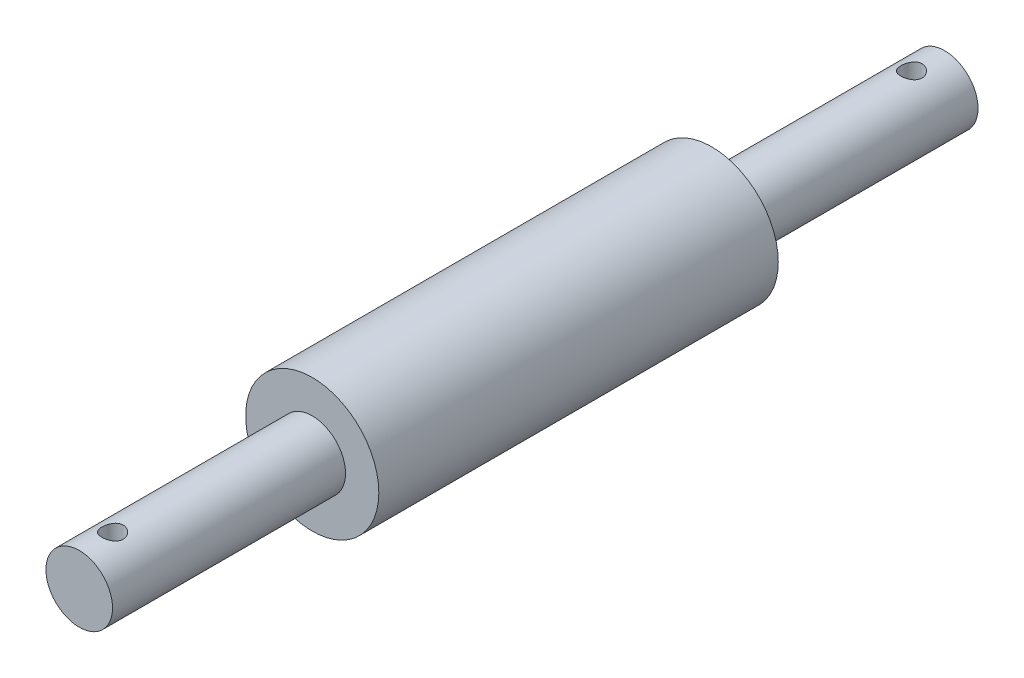
ISO-10303-21;
HEADER;
FILE_DESCRIPTION(('STEP AP214'),'2;1');
FILE_NAME('part.step','',(''),(''),'','','');
FILE_SCHEMA(('AUTOMOTIVE_DESIGN { 1 0 10303 214 1 1 1 1 }'));
ENDSEC;
DATA;
#1=APPLICATION_CONTEXT('core data for automotive mechanical design processes');
#2=APPLICATION_PROTOCOL_DEFINITION('international standard','automotive_design',2000,#1);
#3=PRODUCT_CONTEXT('',#1,'mechanical');
#4=PRODUCT('Part','Part','',(#3));
#5=PRODUCT_RELATED_PRODUCT_CATEGORY('part','',(#4));
#6=PRODUCT_DEFINITION_FORMATION('','',#4);
#7=PRODUCT_DEFINITION_CONTEXT('part definition',#1,'design');
#8=PRODUCT_DEFINITION('design','',#6,#7);
#9=PRODUCT_DEFINITION_SHAPE('','',#8);
#10=(LENGTH_UNIT() NAMED_UNIT(*) SI_UNIT(.MILLI.,.METRE.));
#11=(NAMED_UNIT(*) PLANE_ANGLE_UNIT() SI_UNIT($,.RADIAN.));
#12=(NAMED_UNIT(*) SI_UNIT($,.STERADIAN.) SOLID_ANGLE_UNIT());
#13=UNCERTAINTY_MEASURE_WITH_UNIT(LENGTH_MEASURE(1.E-05),#10,'distance_accuracy_value','');
#14=(GEOMETRIC_REPRESENTATION_CONTEXT(3) GLOBAL_UNCERTAINTY_ASSIGNED_CONTEXT((#13)) GLOBAL_UNIT_ASSIGNED_CONTEXT((#10,
#11,#12)) REPRESENTATION_CONTEXT('',''));
#15=CARTESIAN_POINT('',(0.,0.,0.));
#16=DIRECTION('',(0.,0.,1.));
#17=DIRECTION('',(1.,0.,0.));
#18=AXIS2_PLACEMENT_3D('',#15,#16,#17);
#19=CARTESIAN_POINT('',(0.,0.,130.));
#20=DIRECTION('',(0.,0.,-1.));
#21=DIRECTION('',(-1.,0.,0.));
#22=AXIS2_PLACEMENT_3D('',#19,#20,#21);
#23=CYLINDRICAL_SURFACE('',#22,5.);
#24=CARTESIAN_POINT('',(0.,-5.,126.6));
#25=CARTESIAN_POINT('',(0.0874958063159812,-4.99999978543627,126.599999756349));
#26=CARTESIAN_POINT('',(0.174994637059064,-4.99768184156355,126.592799404721));
#27=CARTESIAN_POINT('',(0.347426901237486,-4.98866262172227,126.564268180471));
#28=CARTESIAN_POINT('',(0.43235986337371,-4.98196054553558,126.542934728182));
#29=CARTESIAN_POINT('',(0.59714922579156,-4.9649038363541,126.486935078788));
#30=CARTESIAN_POINT('',(0.677013473384584,-4.95455502045191,126.452290107629));
#31=CARTESIAN_POINT('',(0.829798762851146,-4.93126901642872,126.370743169913));
#32=CARTESIAN_POINT('',(0.902718607024938,-4.91833138300386,126.323839094234));
#33=CARTESIAN_POINT('',(1.04189475779498,-4.89077067933825,126.217515886496));
#34=CARTESIAN_POINT('',(1.1078960922464,-4.87610957732918,126.157772901047));
#35=CARTESIAN_POINT('',(1.22913423693228,-4.8469706570307,126.028156933453));
#36=CARTESIAN_POINT('',(1.28436891793797,-4.83249287552328,125.958281952345));
#37=CARTESIAN_POINT('',(1.38391395073832,-4.80494810799029,125.80814714549));
#38=CARTESIAN_POINT('',(1.42790123109944,-4.79192785635417,125.727663718729));
#39=CARTESIAN_POINT('',(1.5016091713459,-4.76934657798646,125.55995765623));
#40=CARTESIAN_POINT('',(1.53133379773326,-4.75978458968016,125.472736902012));
#41=CARTESIAN_POINT('',(1.57473134311321,-4.74560122760597,125.296917392727));
#42=CARTESIAN_POINT('',(1.58887896846386,-4.74083414932744,125.208447898248));
#43=CARTESIAN_POINT('',(1.60220433058851,-4.73634831045,125.030272400816));
#44=CARTESIAN_POINT('',(1.6013862709372,-4.73662813227306,124.940566752148));
#45=CARTESIAN_POINT('',(1.58517380736381,-4.74207619100075,124.766434415112));
#46=CARTESIAN_POINT('',(1.57038842132725,-4.7470401743042,124.681943546555));
#47=CARTESIAN_POINT('',(1.52765058974139,-4.76096457446162,124.516711155578));
#48=CARTESIAN_POINT('',(1.49969668269327,-4.76992543490025,124.435970050415));
#49=CARTESIAN_POINT('',(1.43099645158812,-4.7909865416364,124.279102141174));
#50=CARTESIAN_POINT('',(1.39006273103722,-4.80313229469363,124.203063780049));
#51=CARTESIAN_POINT('',(1.29669494334068,-4.82917444861168,124.058737956973));
#52=CARTESIAN_POINT('',(1.24425776827155,-4.8430713221454,123.990452597256));
#53=CARTESIAN_POINT('',(1.12640551540388,-4.87186372141871,123.860135327134));
#54=CARTESIAN_POINT('',(1.06048936249403,-4.8867752080818,123.798559223061));
#55=CARTESIAN_POINT('',(0.91908143221716,-4.91533168114877,123.687221321766));
#56=CARTESIAN_POINT('',(0.843588875652704,-4.92897656433707,123.637460486857));
#57=CARTESIAN_POINT('',(0.68426158071238,-4.95361789744584,123.55083655672));
#58=CARTESIAN_POINT('',(0.600361279440642,-4.96459080547942,123.514086899164));
#59=CARTESIAN_POINT('',(0.427135850361136,-4.98248161100196,123.455360403337));
#60=CARTESIAN_POINT('',(0.337812463131553,-4.98940080204637,123.433378852183));
#61=CARTESIAN_POINT('',(0.160141789589322,-4.99819424239135,123.405599933335));
#62=CARTESIAN_POINT('',(0.0719002860170767,-5.00026060178154,123.399185926389));
#63=CARTESIAN_POINT('',(-0.104410269588104,-4.99968655318444,123.400979218221));
#64=CARTESIAN_POINT('',(-0.192479346087439,-4.99704687004206,123.40918426531));
#65=CARTESIAN_POINT('',(-0.363535018203811,-4.98748380317497,123.439490113081));
#66=CARTESIAN_POINT('',(-0.446594362478021,-4.98067486649266,123.461219910086));
#67=CARTESIAN_POINT('',(-0.607861654600579,-4.96357585995349,123.517501799396));
#68=CARTESIAN_POINT('',(-0.686068993794122,-4.95328535439547,123.552055496602));
#69=CARTESIAN_POINT('',(-0.837596923870446,-4.92995531019905,123.633971017178));
#70=CARTESIAN_POINT('',(-0.91074562050097,-4.9168532627009,123.681632511942));
#71=CARTESIAN_POINT('',(-1.04821150300662,-4.8893940824048,123.788053872986));
#72=CARTESIAN_POINT('',(-1.11252617555398,-4.87503659432078,123.846816886458));
#73=CARTESIAN_POINT('',(-1.23328321488635,-4.84592967283237,123.976674159611));
#74=CARTESIAN_POINT('',(-1.2892857947562,-4.83118884166735,124.048180267688));
#75=CARTESIAN_POINT('',(-1.38854141992569,-4.80360443110145,124.199894674458));
#76=CARTESIAN_POINT('',(-1.43179457025641,-4.79076083607138,124.280102901454));
#77=CARTESIAN_POINT('',(-1.50407580301231,-4.76856262886575,124.446843578656));
#78=CARTESIAN_POINT('',(-1.53315066307446,-4.75919656820051,124.53335413499));
#79=CARTESIAN_POINT('',(-1.57620668246201,-4.74511281699328,124.71040720981));
#80=CARTESIAN_POINT('',(-1.59019395006567,-4.74039324536734,124.800948081136));
#81=CARTESIAN_POINT('',(-1.60222535311566,-4.73633927898768,124.978875969164));
#82=CARTESIAN_POINT('',(-1.60099388446006,-4.73676019091382,125.066209011329));
#83=CARTESIAN_POINT('',(-1.5843835514937,-4.74234159093745,125.239357005435));
#84=CARTESIAN_POINT('',(-1.56900540861121,-4.74750183734632,125.325172034561));
#85=CARTESIAN_POINT('',(-1.52503332416461,-4.76180543144416,125.491483425377));
#86=CARTESIAN_POINT('',(-1.49665627942707,-4.77088327236763,125.572043198893));
#87=CARTESIAN_POINT('',(-1.42766427484383,-4.79197975594362,125.727321760401));
#88=CARTESIAN_POINT('',(-1.38704674114627,-4.80399901699919,125.802039315763));
#89=CARTESIAN_POINT('',(-1.29279266707434,-4.83023494368376,125.946809629814));
#90=CARTESIAN_POINT('',(-1.2386930843158,-4.8445211905268,126.016548262734));
#91=CARTESIAN_POINT('',(-1.11981399792887,-4.87337180847353,126.146191745821));
#92=CARTESIAN_POINT('',(-1.05503158166825,-4.88793625446695,126.206093905199));
#93=CARTESIAN_POINT('',(-0.913912210298366,-4.91631108200117,126.316458285924));
#94=CARTESIAN_POINT('',(-0.837251351760784,-4.93007751880386,126.366518951884));
#95=CARTESIAN_POINT('',(-0.676163529926932,-4.95473787697861,126.452980188097));
#96=CARTESIAN_POINT('',(-0.591739263208152,-4.96563279071294,126.489385479321));
#97=CARTESIAN_POINT('',(-0.423663431644838,-4.98268341064065,126.54524777983));
#98=CARTESIAN_POINT('',(-0.340376766487323,-4.98911901301451,126.565718450583));
#99=CARTESIAN_POINT('',(-0.171394001076115,-4.99777693541394,126.593093142904));
#100=CARTESIAN_POINT('',(-0.0856984512613927,-5.00000021015613,126.600000238645));
#101=CARTESIAN_POINT('',(0.,-5.,126.6));
#102=B_SPLINE_CURVE_WITH_KNOTS('',3,(#24,#25,#26,#27,#28,#29,#30,#31,#32,#33,#34,#35,#36,#37,
#38,#39,#40,#41,#42,#43,#44,#45,#46,#47,#48,#49,#50,#51,#52,#53,#54,#55,#56,#57,#58,#59,#60,#61,
#62,#63,#64,#65,#66,#67,#68,#69,#70,#71,#72,#73,#74,#75,#76,#77,#78,#79,#80,#81,#82,#83,#84,#85,
#86,#87,#88,#89,#90,#91,#92,#93,#94,#95,#96,#97,#98,#99,#100,#101),.UNSPECIFIED.,.T.,.F.,(4,2,2,
2,2,2,2,2,2,2,2,2,2,2,2,2,2,2,2,2,2,2,2,2,2,2,2,2,2,2,2,2,2,2,2,2,2,2,4),(0.,0.262172289866492,
0.524392446348363,0.7861962021117,1.04804502964702,1.31749718151566,1.58700256668425,
1.86354828826629,2.14001705671956,2.40780489999506,2.67551752794223,2.93207089351445,
3.18865273918778,3.44912195934763,3.70966163813008,3.98267284808621,4.25570628624554,
4.53106471334193,4.80633522466348,5.07051010591344,5.33464430132698,5.59183416387788,
5.84905622438333,6.11273355055081,6.37648573964818,6.65122993053058,6.92597185797941,
7.19980110675104,7.47351945288795,7.7342613497285,7.9949899504299,8.25151822881314,
8.50810048600701,8.77513756675918,9.04224757485581,9.31866285531258,9.5949824844973,
9.85182740305347,10.1086141011961),.UNSPECIFIED.);
#103=CARTESIAN_POINT('',(0.,-5.,126.6));
#104=VERTEX_POINT('',#103);
#105=EDGE_CURVE('E47',#104,#104,#102,.T.);
#106=ORIENTED_EDGE('',*,*,#105,.T.);
#107=EDGE_LOOP('',(#106));
#108=FACE_BOUND('',#107,.T.);
#109=CARTESIAN_POINT('',(0.,5.,126.6));
#110=CARTESIAN_POINT('',(-0.0874958063159812,4.99999978543627,126.599999756349));
#111=CARTESIAN_POINT('',(-0.174994637059064,4.99768184156355,126.592799404721));
#112=CARTESIAN_POINT('',(-0.347426901237486,4.98866262172227,126.564268180471));
#113=CARTESIAN_POINT('',(-0.43235986337371,4.98196054553558,126.542934728182));
#114=CARTESIAN_POINT('',(-0.59714922579156,4.9649038363541,126.486935078788));
#115=CARTESIAN_POINT('',(-0.677013473384584,4.95455502045191,126.452290107629));
#116=CARTESIAN_POINT('',(-0.829798762851146,4.93126901642872,126.370743169913));
#117=CARTESIAN_POINT('',(-0.902718607024938,4.91833138300386,126.323839094234));
#118=CARTESIAN_POINT('',(-1.04189475779498,4.89077067933825,126.217515886496));
#119=CARTESIAN_POINT('',(-1.1078960922464,4.87610957732918,126.157772901047));
#120=CARTESIAN_POINT('',(-1.22913423693228,4.8469706570307,126.028156933453));
#121=CARTESIAN_POINT('',(-1.28436891793797,4.83249287552328,125.958281952345));
#122=CARTESIAN_POINT('',(-1.38391395073832,4.80494810799029,125.80814714549));
#123=CARTESIAN_POINT('',(-1.42790123109944,4.79192785635417,125.727663718729));
#124=CARTESIAN_POINT('',(-1.5016091713459,4.76934657798646,125.55995765623));
#125=CARTESIAN_POINT('',(-1.53133379773326,4.75978458968016,125.472736902012));
#126=CARTESIAN_POINT('',(-1.57473134311321,4.74560122760597,125.296917392727));
#127=CARTESIAN_POINT('',(-1.58887896846386,4.74083414932744,125.208447898248));
#128=CARTESIAN_POINT('',(-1.60220433058851,4.73634831045,125.030272400816));
#129=CARTESIAN_POINT('',(-1.6013862709372,4.73662813227306,124.940566752148));
#130=CARTESIAN_POINT('',(-1.58517380736381,4.74207619100075,124.766434415112));
#131=CARTESIAN_POINT('',(-1.57038842132725,4.7470401743042,124.681943546555));
#132=CARTESIAN_POINT('',(-1.52765058974139,4.76096457446162,124.516711155578));
#133=CARTESIAN_POINT('',(-1.49969668269327,4.76992543490025,124.435970050415));
#134=CARTESIAN_POINT('',(-1.43099645158812,4.7909865416364,124.279102141174));
#135=CARTESIAN_POINT('',(-1.39006273103722,4.80313229469363,124.203063780049));
#136=CARTESIAN_POINT('',(-1.29669494334068,4.82917444861168,124.058737956973));
#137=CARTESIAN_POINT('',(-1.24425776827155,4.8430713221454,123.990452597256));
#138=CARTESIAN_POINT('',(-1.12640551540388,4.87186372141871,123.860135327134));
#139=CARTESIAN_POINT('',(-1.06048936249403,4.8867752080818,123.798559223061));
#140=CARTESIAN_POINT('',(-0.91908143221716,4.91533168114877,123.687221321766));
#141=CARTESIAN_POINT('',(-0.843588875652704,4.92897656433707,123.637460486857));
#142=CARTESIAN_POINT('',(-0.68426158071238,4.95361789744584,123.55083655672));
#143=CARTESIAN_POINT('',(-0.600361279440642,4.96459080547942,123.514086899164));
#144=CARTESIAN_POINT('',(-0.427135850361136,4.98248161100196,123.455360403337));
#145=CARTESIAN_POINT('',(-0.337812463131553,4.98940080204637,123.433378852183));
#146=CARTESIAN_POINT('',(-0.160141789589322,4.99819424239135,123.405599933335));
#147=CARTESIAN_POINT('',(-0.0719002860170767,5.00026060178154,123.399185926389));
#148=CARTESIAN_POINT('',(0.104410269588104,4.99968655318444,123.400979218221));
#149=CARTESIAN_POINT('',(0.192479346087439,4.99704687004206,123.40918426531));
#150=CARTESIAN_POINT('',(0.363535018203811,4.98748380317497,123.439490113081));
#151=CARTESIAN_POINT('',(0.446594362478021,4.98067486649266,123.461219910086));
#152=CARTESIAN_POINT('',(0.607861654600579,4.96357585995349,123.517501799396));
#153=CARTESIAN_POINT('',(0.686068993794122,4.95328535439547,123.552055496602));
#154=CARTESIAN_POINT('',(0.837596923870446,4.92995531019905,123.633971017178));
#155=CARTESIAN_POINT('',(0.91074562050097,4.9168532627009,123.681632511942));
#156=CARTESIAN_POINT('',(1.04821150300662,4.8893940824048,123.788053872986));
#157=CARTESIAN_POINT('',(1.11252617555398,4.87503659432078,123.846816886458));
#158=CARTESIAN_POINT('',(1.23328321488635,4.84592967283237,123.976674159611));
#159=CARTESIAN_POINT('',(1.2892857947562,4.83118884166735,124.048180267688));
#160=CARTESIAN_POINT('',(1.38854141992569,4.80360443110145,124.199894674458));
#161=CARTESIAN_POINT('',(1.43179457025641,4.79076083607138,124.280102901454));
#162=CARTESIAN_POINT('',(1.50407580301231,4.76856262886575,124.446843578656));
#163=CARTESIAN_POINT('',(1.53315066307446,4.75919656820051,124.53335413499));
#164=CARTESIAN_POINT('',(1.57620668246201,4.74511281699328,124.71040720981));
#165=CARTESIAN_POINT('',(1.59019395006567,4.74039324536734,124.800948081136));
#166=CARTESIAN_POINT('',(1.60222535311566,4.73633927898768,124.978875969164));
#167=CARTESIAN_POINT('',(1.60099388446006,4.73676019091382,125.066209011329));
#168=CARTESIAN_POINT('',(1.5843835514937,4.74234159093745,125.239357005435));
#169=CARTESIAN_POINT('',(1.56900540861121,4.74750183734632,125.325172034561));
#170=CARTESIAN_POINT('',(1.52503332416461,4.76180543144416,125.491483425377));
#171=CARTESIAN_POINT('',(1.49665627942707,4.77088327236763,125.572043198893));
#172=CARTESIAN_POINT('',(1.42766427484383,4.79197975594362,125.727321760401));
#173=CARTESIAN_POINT('',(1.38704674114627,4.80399901699919,125.802039315763));
#174=CARTESIAN_POINT('',(1.29279266707434,4.83023494368376,125.946809629814));
#175=CARTESIAN_POINT('',(1.2386930843158,4.8445211905268,126.016548262734));
#176=CARTESIAN_POINT('',(1.11981399792887,4.87337180847353,126.146191745821));
#177=CARTESIAN_POINT('',(1.05503158166825,4.88793625446695,126.206093905199));
#178=CARTESIAN_POINT('',(0.913912210298366,4.91631108200117,126.316458285924));
#179=CARTESIAN_POINT('',(0.837251351760784,4.93007751880386,126.366518951884));
#180=CARTESIAN_POINT('',(0.676163529926932,4.95473787697861,126.452980188097));
#181=CARTESIAN_POINT('',(0.591739263208152,4.96563279071294,126.489385479321));
#182=CARTESIAN_POINT('',(0.423663431644838,4.98268341064065,126.54524777983));
#183=CARTESIAN_POINT('',(0.340376766487323,4.98911901301451,126.565718450583));
#184=CARTESIAN_POINT('',(0.171394001076115,4.99777693541394,126.593093142904));
#185=CARTESIAN_POINT('',(0.0856984512613927,5.00000021015613,126.600000238645));
#186=CARTESIAN_POINT('',(0.,5.,126.6));
#187=B_SPLINE_CURVE_WITH_KNOTS('',3,(#109,#110,#111,#112,#113,#114,#115,#116,#117,#118,#119,
#120,#121,#122,#123,#124,#125,#126,#127,#128,#129,#130,#131,#132,#133,#134,#135,#136,#137,#138,
#139,#140,#141,#142,#143,#144,#145,#146,#147,#148,#149,#150,#151,#152,#153,#154,#155,#156,#157,
#158,#159,#160,#161,#162,#163,#164,#165,#166,#167,#168,#169,#170,#171,#172,#173,#174,#175,#176,
#177,#178,#179,#180,#181,#182,#183,#184,#185,#186),.UNSPECIFIED.,.T.,.F.,(4,2,2,2,2,2,2,2,2,2,2,
2,2,2,2,2,2,2,2,2,2,2,2,2,2,2,2,2,2,2,2,2,2,2,2,2,2,2,4),(0.,0.262172289866492,
0.524392446348363,0.7861962021117,1.04804502964702,1.31749718151566,1.58700256668425,
1.86354828826629,2.14001705671956,2.40780489999506,2.67551752794223,2.93207089351445,
3.18865273918778,3.44912195934763,3.70966163813008,3.98267284808621,4.25570628624554,
4.53106471334193,4.80633522466348,5.07051010591344,5.33464430132698,5.59183416387788,
5.84905622438333,6.11273355055081,6.37648573964818,6.65122993053058,6.92597185797941,
7.19980110675104,7.47351945288795,7.7342613497285,7.9949899504299,8.25151822881314,
8.50810048600701,8.77513756675918,9.04224757485581,9.31866285531258,9.5949824844973,
9.85182740305347,10.1086141011961),.UNSPECIFIED.);
#188=CARTESIAN_POINT('',(0.,5.,126.6));
#189=VERTEX_POINT('',#188);
#190=EDGE_CURVE('E125',#189,#189,#187,.T.);
#191=ORIENTED_EDGE('',*,*,#190,.T.);
#192=EDGE_LOOP('',(#191));
#193=FACE_BOUND('',#192,.T.);
#194=CARTESIAN_POINT('',(0.,0.,95.));
#195=DIRECTION('',(0.,0.,1.));
#196=DIRECTION('',(1.,0.,0.));
#197=AXIS2_PLACEMENT_3D('',#194,#195,#196);
#198=CIRCLE('',#197,5.);
#199=CARTESIAN_POINT('',(5.,0.,95.));
#200=VERTEX_POINT('',#199);
#201=EDGE_CURVE('E66',#200,#200,#198,.T.);
#202=ORIENTED_EDGE('',*,*,#201,.T.);
#203=EDGE_LOOP('',(#202));
#204=FACE_BOUND('',#203,.T.);
#205=CARTESIAN_POINT('',(0.,0.,130.));
#206=DIRECTION('',(0.,0.,1.));
#207=DIRECTION('',(1.,0.,0.));
#208=AXIS2_PLACEMENT_3D('',#205,#206,#207);
#209=CIRCLE('',#208,5.);
#210=CARTESIAN_POINT('',(5.,0.,130.));
#211=VERTEX_POINT('',#210);
#212=EDGE_CURVE('E60',#211,#211,#209,.T.);
#213=ORIENTED_EDGE('',*,*,#212,.F.);
#214=EDGE_LOOP('',(#213));
#215=FACE_BOUND('',#214,.T.);
#216=ADVANCED_FACE('F44',(#108,#193,#204,#215),#23,.T.);
#217=CARTESIAN_POINT('',(0.,0.,130.));
#218=DIRECTION('',(0.,0.,1.));
#219=DIRECTION('',(1.,0.,0.));
#220=AXIS2_PLACEMENT_3D('',#217,#218,#219);
#221=PLANE('',#220);
#222=ORIENTED_EDGE('',*,*,#212,.T.);
#223=EDGE_LOOP('',(#222));
#224=FACE_BOUND('',#223,.T.);
#225=ADVANCED_FACE('F101',(#224),#221,.T.);
#226=CARTESIAN_POINT('',(0.,0.,-28.2842712474619));
#227=DIRECTION('',(0.,0.,1.));
#228=DIRECTION('',(1.,0.,0.));
#229=AXIS2_PLACEMENT_3D('',#226,#227,#228);
#230=CYLINDRICAL_SURFACE('',#229,10.);
#231=CARTESIAN_POINT('',(0.,0.,35.));
#232=DIRECTION('',(0.,0.,1.));
#233=DIRECTION('',(1.,0.,0.));
#234=AXIS2_PLACEMENT_3D('',#231,#232,#233);
#235=CIRCLE('',#234,10.);
#236=CARTESIAN_POINT('',(10.,0.,35.));
#237=VERTEX_POINT('',#236);
#238=EDGE_CURVE('E68',#237,#237,#235,.F.);
#239=ORIENTED_EDGE('',*,*,#238,.F.);
#240=EDGE_LOOP('',(#239));
#241=FACE_BOUND('',#240,.T.);
#242=CARTESIAN_POINT('',(0.,0.,95.));
#243=DIRECTION('',(0.,0.,1.));
#244=DIRECTION('',(1.,0.,0.));
#245=AXIS2_PLACEMENT_3D('',#242,#243,#244);
#246=CIRCLE('',#245,10.);
#247=CARTESIAN_POINT('',(10.,0.,95.));
#248=VERTEX_POINT('',#247);
#249=EDGE_CURVE('E129',#248,#248,#246,.T.);
#250=ORIENTED_EDGE('',*,*,#249,.F.);
#251=EDGE_LOOP('',(#250));
#252=FACE_BOUND('',#251,.T.);
#253=ADVANCED_FACE('F100',(#241,#252),#230,.T.);
#254=CARTESIAN_POINT('',(0.,0.,95.));
#255=DIRECTION('',(0.,0.,1.));
#256=DIRECTION('',(1.,0.,0.));
#257=AXIS2_PLACEMENT_3D('',#254,#255,#256);
#258=PLANE('',#257);
#259=ORIENTED_EDGE('',*,*,#201,.F.);
#260=EDGE_LOOP('',(#259));
#261=FACE_BOUND('',#260,.T.);
#262=ORIENTED_EDGE('',*,*,#249,.T.);
#263=EDGE_LOOP('',(#262));
#264=FACE_BOUND('',#263,.T.);
#265=ADVANCED_FACE('F94',(#261,#264),#258,.T.);
#266=CARTESIAN_POINT('',(0.,0.,35.));
#267=DIRECTION('',(0.,0.,1.));
#268=DIRECTION('',(1.,0.,0.));
#269=AXIS2_PLACEMENT_3D('',#266,#267,#268);
#270=PLANE('',#269);
#271=CARTESIAN_POINT('',(0.,0.,35.));
#272=DIRECTION('',(0.,0.,1.));
#273=DIRECTION('',(1.,0.,0.));
#274=AXIS2_PLACEMENT_3D('',#271,#272,#273);
#275=CIRCLE('',#274,5.);
#276=CARTESIAN_POINT('',(5.,0.,35.));
#277=VERTEX_POINT('',#276);
#278=EDGE_CURVE('E11',#277,#277,#275,.T.);
#279=ORIENTED_EDGE('',*,*,#278,.T.);
#280=EDGE_LOOP('',(#279));
#281=FACE_BOUND('',#280,.T.);
#282=ORIENTED_EDGE('',*,*,#238,.T.);
#283=EDGE_LOOP('',(#282));
#284=FACE_BOUND('',#283,.T.);
#285=ADVANCED_FACE('F90',(#281,#284),#270,.F.);
#286=CARTESIAN_POINT('',(0.,0.,0.));
#287=DIRECTION('',(0.,0.,1.));
#288=DIRECTION('',(1.,0.,0.));
#289=AXIS2_PLACEMENT_3D('',#286,#287,#288);
#290=PLANE('',#289);
#291=CARTESIAN_POINT('',(0.,0.,0.));
#292=DIRECTION('',(0.,0.,1.));
#293=DIRECTION('',(1.,0.,0.));
#294=AXIS2_PLACEMENT_3D('',#291,#292,#293);
#295=CIRCLE('',#294,5.);
#296=CARTESIAN_POINT('',(5.,0.,0.));
#297=VERTEX_POINT('',#296);
#298=EDGE_CURVE('E64',#297,#297,#295,.T.);
#299=ORIENTED_EDGE('',*,*,#298,.F.);
#300=EDGE_LOOP('',(#299));
#301=FACE_BOUND('',#300,.T.);
#302=ADVANCED_FACE('F91',(#301),#290,.F.);
#303=CARTESIAN_POINT('',(0.,-5.,6.6));
#304=CARTESIAN_POINT('',(0.0874958063159797,-4.99999978543627,6.59999975634942));
#305=CARTESIAN_POINT('',(0.174994637059061,-4.99768184156355,6.59279940472074));
#306=CARTESIAN_POINT('',(0.347426901237483,-4.98866262172227,6.56426818047074));
#307=CARTESIAN_POINT('',(0.432359863373708,-4.98196054553558,6.54293472818209));
#308=CARTESIAN_POINT('',(0.597149225791565,-4.9649038363541,6.48693507878823));
#309=CARTESIAN_POINT('',(0.677013473384595,-4.95455502045191,6.4522901076294));
#310=CARTESIAN_POINT('',(0.829798762851157,-4.93126901642872,6.37074316991274));
#311=CARTESIAN_POINT('',(0.902718607024946,-4.91833138300386,6.32383909423439));
#312=CARTESIAN_POINT('',(1.04189475779498,-4.89077067933825,6.21751588649597));
#313=CARTESIAN_POINT('',(1.1078960922464,-4.87610957732918,6.15777290104658));
#314=CARTESIAN_POINT('',(1.22913423693228,-4.8469706570307,6.02815693345259));
#315=CARTESIAN_POINT('',(1.28436891793797,-4.83249287552328,5.95828195234513));
#316=CARTESIAN_POINT('',(1.38391395073831,-4.8049481079903,5.80814714548961));
#317=CARTESIAN_POINT('',(1.42790123109944,-4.79192785635417,5.72766371872946));
#318=CARTESIAN_POINT('',(1.5016091713459,-4.76934657798646,5.55995765622989));
#319=CARTESIAN_POINT('',(1.53133379773326,-4.75978458968016,5.47273690201169));
#320=CARTESIAN_POINT('',(1.57473134311321,-4.74560122760597,5.29691739272712));
#321=CARTESIAN_POINT('',(1.58887896846385,-4.74083414932744,5.20844789824797));
#322=CARTESIAN_POINT('',(1.60220433058851,-4.73634831045,5.03027240081554));
#323=CARTESIAN_POINT('',(1.6013862709372,-4.73662813227306,4.94056675214803));
#324=CARTESIAN_POINT('',(1.58517380736381,-4.74207619100075,4.76643441511176));
#325=CARTESIAN_POINT('',(1.57038842132725,-4.7470401743042,4.6819435465553));
#326=CARTESIAN_POINT('',(1.52765058974139,-4.76096457446162,4.51671115557794));
#327=CARTESIAN_POINT('',(1.49969668269327,-4.76992543490025,4.4359700504148));
#328=CARTESIAN_POINT('',(1.43099645158812,-4.7909865416364,4.27910214117426));
#329=CARTESIAN_POINT('',(1.39006273103722,-4.80313229469362,4.20306378004852));
#330=CARTESIAN_POINT('',(1.29669494334068,-4.82917444861168,4.05873795697323));
#331=CARTESIAN_POINT('',(1.24425776827155,-4.8430713221454,3.99045259725646));
#332=CARTESIAN_POINT('',(1.12640551540387,-4.87186372141871,3.86013532713372));
#333=CARTESIAN_POINT('',(1.06048936249402,-4.8867752080818,3.79855922306119));
#334=CARTESIAN_POINT('',(0.919081432217149,-4.91533168114877,3.68722132176635));
#335=CARTESIAN_POINT('',(0.843588875652695,-4.92897656433707,3.63746048685711));
#336=CARTESIAN_POINT('',(0.684261580712375,-4.95361789744584,3.55083655671978));
#337=CARTESIAN_POINT('',(0.600361279440636,-4.96459080547942,3.51408689916357));
#338=CARTESIAN_POINT('',(0.427135850361131,-4.98248161100196,3.45536040333729));
#339=CARTESIAN_POINT('',(0.337812463131549,-4.98940080204637,3.43337885218328));
#340=CARTESIAN_POINT('',(0.160141789589319,-4.99819424239135,3.40559993333479));
#341=CARTESIAN_POINT('',(0.0719002860170748,-5.00026060178154,3.3991859263889));
#342=CARTESIAN_POINT('',(-0.104410269588105,-4.99968655318444,3.4009792182213));
#343=CARTESIAN_POINT('',(-0.192479346087439,-4.99704687004206,3.40918426530988));
#344=CARTESIAN_POINT('',(-0.363535018203811,-4.98748380317497,3.43949011308117));
#345=CARTESIAN_POINT('',(-0.446594362478022,-4.98067486649266,3.4612199100859));
#346=CARTESIAN_POINT('',(-0.607861654600582,-4.96357585995349,3.51750179939625));
#347=CARTESIAN_POINT('',(-0.686068993794124,-4.95328535439547,3.55205549660218));
#348=CARTESIAN_POINT('',(-0.837596923870445,-4.92995531019905,3.63397101717815));
#349=CARTESIAN_POINT('',(-0.910745620500967,-4.9168532627009,3.6816325119423));
#350=CARTESIAN_POINT('',(-1.04821150300662,-4.8893940824048,3.78805387298564));
#351=CARTESIAN_POINT('',(-1.11252617555398,-4.87503659432078,3.8468168864583));
#352=CARTESIAN_POINT('',(-1.23328321488635,-4.84592967283237,3.97667415961096));
#353=CARTESIAN_POINT('',(-1.2892857947562,-4.83118884166735,4.04818026768848));
#354=CARTESIAN_POINT('',(-1.38854141992569,-4.80360443110145,4.19989467445821));
#355=CARTESIAN_POINT('',(-1.43179457025642,-4.79076083607138,4.28010290145405));
#356=CARTESIAN_POINT('',(-1.50407580301231,-4.76856262886575,4.44684357865608));
#357=CARTESIAN_POINT('',(-1.53315066307446,-4.75919656820051,4.53335413498969));
#358=CARTESIAN_POINT('',(-1.57620668246201,-4.74511281699328,4.71040720981033));
#359=CARTESIAN_POINT('',(-1.59019395006567,-4.74039324536734,4.80094808113598));
#360=CARTESIAN_POINT('',(-1.60222535311566,-4.73633927898768,4.97887596916399));
#361=CARTESIAN_POINT('',(-1.60099388446006,-4.73676019091382,5.06620901132899));
#362=CARTESIAN_POINT('',(-1.5843835514937,-4.74234159093745,5.2393570054347));
#363=CARTESIAN_POINT('',(-1.56900540861121,-4.74750183734632,5.32517203456103));
#364=CARTESIAN_POINT('',(-1.52503332416461,-4.76180543144416,5.49148342537688));
#365=CARTESIAN_POINT('',(-1.49665627942706,-4.77088327236763,5.57204319889287));
#366=CARTESIAN_POINT('',(-1.42766427484382,-4.79197975594362,5.72732176040081));
#367=CARTESIAN_POINT('',(-1.38704674114626,-4.8039990169992,5.8020393157627));
#368=CARTESIAN_POINT('',(-1.29279266707432,-4.83023494368376,5.94680962981441));
#369=CARTESIAN_POINT('',(-1.23869308431578,-4.8445211905268,6.01654826273404));
#370=CARTESIAN_POINT('',(-1.11981399792884,-4.87337180847353,6.14619174582096));
#371=CARTESIAN_POINT('',(-1.05503158166823,-4.88793625446696,6.20609390519864));
#372=CARTESIAN_POINT('',(-0.913912210298352,-4.91631108200117,6.31645828592383));
#373=CARTESIAN_POINT('',(-0.837251351760781,-4.93007751880386,6.3665189518843));
#374=CARTESIAN_POINT('',(-0.676163529926938,-4.9547378769786,6.45298018809723));
#375=CARTESIAN_POINT('',(-0.591739263208158,-4.96563279071293,6.48938547932079));
#376=CARTESIAN_POINT('',(-0.423663431644845,-4.98268341064065,6.54524777983044));
#377=CARTESIAN_POINT('',(-0.34037676648733,-4.98911901301451,6.56571845058311));
#378=CARTESIAN_POINT('',(-0.171394001076119,-4.99777693541394,6.59309314290401));
#379=CARTESIAN_POINT('',(-0.0856984512613947,-5.00000021015613,6.60000023864547));
#380=CARTESIAN_POINT('',(0.,-5.,6.6));
#381=B_SPLINE_CURVE_WITH_KNOTS('',3,(#303,#304,#305,#306,#307,#308,#309,#310,#311,#312,#313,
#314,#315,#316,#317,#318,#319,#320,#321,#322,#323,#324,#325,#326,#327,#328,#329,#330,#331,#332,
#333,#334,#335,#336,#337,#338,#339,#340,#341,#342,#343,#344,#345,#346,#347,#348,#349,#350,#351,
#352,#353,#354,#355,#356,#357,#358,#359,#360,#361,#362,#363,#364,#365,#366,#367,#368,#369,#370,
#371,#372,#373,#374,#375,#376,#377,#378,#379,#380),.UNSPECIFIED.,.T.,.F.,(4,2,2,2,2,2,2,2,2,2,2,
2,2,2,2,2,2,2,2,2,2,2,2,2,2,2,2,2,2,2,2,2,2,2,2,2,2,2,4),(0.,0.262172289866487,
0.524392446348364,0.786196202111712,1.04804502964703,1.31749718151567,1.58700256668426,
1.86354828826627,2.14001705671955,2.40780489999506,2.67551752794223,2.93207089351445,
3.18865273918778,3.44912195934763,3.70966163813009,3.98267284808623,4.25570628624555,
4.53106471334194,4.80633522466348,5.07051010591344,5.33464430132699,5.59183416387789,
5.84905622438333,6.11273355055081,6.37648573964818,6.65122993053059,6.92597185797942,
7.19980110675104,7.47351945288796,7.73426134972847,7.99498995042988,8.25151822881316,
8.50810048600704,8.77513756675922,9.04224757485583,9.31866285531259,9.5949824844973,
9.85182740305347,10.1086141011961),.UNSPECIFIED.);
#382=CARTESIAN_POINT('',(0.,-5.,6.6));
#383=VERTEX_POINT('',#382);
#384=EDGE_CURVE('E79',#383,#383,#381,.T.);
#385=ORIENTED_EDGE('',*,*,#384,.T.);
#386=EDGE_LOOP('',(#385));
#387=FACE_BOUND('',#386,.T.);
#388=CARTESIAN_POINT('',(0.,5.,6.6));
#389=CARTESIAN_POINT('',(-0.0874958063159797,4.99999978543627,6.59999975634942));
#390=CARTESIAN_POINT('',(-0.174994637059061,4.99768184156355,6.59279940472074));
#391=CARTESIAN_POINT('',(-0.347426901237483,4.98866262172227,6.56426818047074));
#392=CARTESIAN_POINT('',(-0.432359863373708,4.98196054553558,6.54293472818209));
#393=CARTESIAN_POINT('',(-0.597149225791565,4.9649038363541,6.48693507878823));
#394=CARTESIAN_POINT('',(-0.677013473384595,4.95455502045191,6.4522901076294));
#395=CARTESIAN_POINT('',(-0.829798762851157,4.93126901642872,6.37074316991274));
#396=CARTESIAN_POINT('',(-0.902718607024946,4.91833138300386,6.32383909423439));
#397=CARTESIAN_POINT('',(-1.04189475779498,4.89077067933825,6.21751588649597));
#398=CARTESIAN_POINT('',(-1.1078960922464,4.87610957732918,6.15777290104658));
#399=CARTESIAN_POINT('',(-1.22913423693228,4.8469706570307,6.02815693345259));
#400=CARTESIAN_POINT('',(-1.28436891793797,4.83249287552328,5.95828195234513));
#401=CARTESIAN_POINT('',(-1.38391395073831,4.8049481079903,5.80814714548961));
#402=CARTESIAN_POINT('',(-1.42790123109944,4.79192785635417,5.72766371872946));
#403=CARTESIAN_POINT('',(-1.5016091713459,4.76934657798646,5.55995765622989));
#404=CARTESIAN_POINT('',(-1.53133379773326,4.75978458968016,5.47273690201169));
#405=CARTESIAN_POINT('',(-1.57473134311321,4.74560122760597,5.29691739272712));
#406=CARTESIAN_POINT('',(-1.58887896846385,4.74083414932744,5.20844789824797));
#407=CARTESIAN_POINT('',(-1.60220433058851,4.73634831045,5.03027240081554));
#408=CARTESIAN_POINT('',(-1.6013862709372,4.73662813227306,4.94056675214803));
#409=CARTESIAN_POINT('',(-1.58517380736381,4.74207619100075,4.76643441511176));
#410=CARTESIAN_POINT('',(-1.57038842132725,4.7470401743042,4.6819435465553));
#411=CARTESIAN_POINT('',(-1.52765058974139,4.76096457446162,4.51671115557794));
#412=CARTESIAN_POINT('',(-1.49969668269327,4.76992543490025,4.4359700504148));
#413=CARTESIAN_POINT('',(-1.43099645158812,4.7909865416364,4.27910214117426));
#414=CARTESIAN_POINT('',(-1.39006273103722,4.80313229469362,4.20306378004852));
#415=CARTESIAN_POINT('',(-1.29669494334068,4.82917444861168,4.05873795697323));
#416=CARTESIAN_POINT('',(-1.24425776827155,4.8430713221454,3.99045259725646));
#417=CARTESIAN_POINT('',(-1.12640551540387,4.87186372141871,3.86013532713372));
#418=CARTESIAN_POINT('',(-1.06048936249402,4.8867752080818,3.79855922306119));
#419=CARTESIAN_POINT('',(-0.919081432217149,4.91533168114877,3.68722132176635));
#420=CARTESIAN_POINT('',(-0.843588875652695,4.92897656433707,3.63746048685711));
#421=CARTESIAN_POINT('',(-0.684261580712375,4.95361789744584,3.55083655671978));
#422=CARTESIAN_POINT('',(-0.600361279440636,4.96459080547942,3.51408689916357));
#423=CARTESIAN_POINT('',(-0.427135850361131,4.98248161100196,3.45536040333729));
#424=CARTESIAN_POINT('',(-0.337812463131549,4.98940080204637,3.43337885218328));
#425=CARTESIAN_POINT('',(-0.160141789589319,4.99819424239135,3.40559993333479));
#426=CARTESIAN_POINT('',(-0.0719002860170748,5.00026060178154,3.3991859263889));
#427=CARTESIAN_POINT('',(0.104410269588105,4.99968655318444,3.4009792182213));
#428=CARTESIAN_POINT('',(0.192479346087439,4.99704687004206,3.40918426530988));
#429=CARTESIAN_POINT('',(0.363535018203811,4.98748380317497,3.43949011308117));
#430=CARTESIAN_POINT('',(0.446594362478022,4.98067486649266,3.4612199100859));
#431=CARTESIAN_POINT('',(0.607861654600582,4.96357585995349,3.51750179939625));
#432=CARTESIAN_POINT('',(0.686068993794124,4.95328535439547,3.55205549660218));
#433=CARTESIAN_POINT('',(0.837596923870445,4.92995531019905,3.63397101717815));
#434=CARTESIAN_POINT('',(0.910745620500967,4.9168532627009,3.6816325119423));
#435=CARTESIAN_POINT('',(1.04821150300662,4.8893940824048,3.78805387298564));
#436=CARTESIAN_POINT('',(1.11252617555398,4.87503659432078,3.8468168864583));
#437=CARTESIAN_POINT('',(1.23328321488635,4.84592967283237,3.97667415961096));
#438=CARTESIAN_POINT('',(1.2892857947562,4.83118884166735,4.04818026768848));
#439=CARTESIAN_POINT('',(1.38854141992569,4.80360443110145,4.19989467445821));
#440=CARTESIAN_POINT('',(1.43179457025642,4.79076083607138,4.28010290145405));
#441=CARTESIAN_POINT('',(1.50407580301231,4.76856262886575,4.44684357865608));
#442=CARTESIAN_POINT('',(1.53315066307446,4.75919656820051,4.53335413498969));
#443=CARTESIAN_POINT('',(1.57620668246201,4.74511281699328,4.71040720981033));
#444=CARTESIAN_POINT('',(1.59019395006567,4.74039324536734,4.80094808113598));
#445=CARTESIAN_POINT('',(1.60222535311566,4.73633927898768,4.97887596916399));
#446=CARTESIAN_POINT('',(1.60099388446006,4.73676019091382,5.06620901132899));
#447=CARTESIAN_POINT('',(1.5843835514937,4.74234159093745,5.2393570054347));
#448=CARTESIAN_POINT('',(1.56900540861121,4.74750183734632,5.32517203456103));
#449=CARTESIAN_POINT('',(1.52503332416461,4.76180543144416,5.49148342537688));
#450=CARTESIAN_POINT('',(1.49665627942706,4.77088327236763,5.57204319889287));
#451=CARTESIAN_POINT('',(1.42766427484382,4.79197975594362,5.72732176040081));
#452=CARTESIAN_POINT('',(1.38704674114626,4.8039990169992,5.8020393157627));
#453=CARTESIAN_POINT('',(1.29279266707432,4.83023494368376,5.94680962981441));
#454=CARTESIAN_POINT('',(1.23869308431578,4.8445211905268,6.01654826273404));
#455=CARTESIAN_POINT('',(1.11981399792884,4.87337180847353,6.14619174582096));
#456=CARTESIAN_POINT('',(1.05503158166823,4.88793625446696,6.20609390519864));
#457=CARTESIAN_POINT('',(0.913912210298352,4.91631108200117,6.31645828592383));
#458=CARTESIAN_POINT('',(0.837251351760781,4.93007751880386,6.3665189518843));
#459=CARTESIAN_POINT('',(0.676163529926938,4.9547378769786,6.45298018809723));
#460=CARTESIAN_POINT('',(0.591739263208158,4.96563279071293,6.48938547932079));
#461=CARTESIAN_POINT('',(0.423663431644845,4.98268341064065,6.54524777983044));
#462=CARTESIAN_POINT('',(0.34037676648733,4.98911901301451,6.56571845058311));
#463=CARTESIAN_POINT('',(0.171394001076119,4.99777693541394,6.59309314290401));
#464=CARTESIAN_POINT('',(0.0856984512613947,5.00000021015613,6.60000023864547));
#465=CARTESIAN_POINT('',(0.,5.,6.6));
#466=B_SPLINE_CURVE_WITH_KNOTS('',3,(#388,#389,#390,#391,#392,#393,#394,#395,#396,#397,#398,
#399,#400,#401,#402,#403,#404,#405,#406,#407,#408,#409,#410,#411,#412,#413,#414,#415,#416,#417,
#418,#419,#420,#421,#422,#423,#424,#425,#426,#427,#428,#429,#430,#431,#432,#433,#434,#435,#436,
#437,#438,#439,#440,#441,#442,#443,#444,#445,#446,#447,#448,#449,#450,#451,#452,#453,#454,#455,
#456,#457,#458,#459,#460,#461,#462,#463,#464,#465),.UNSPECIFIED.,.T.,.F.,(4,2,2,2,2,2,2,2,2,2,2,
2,2,2,2,2,2,2,2,2,2,2,2,2,2,2,2,2,2,2,2,2,2,2,2,2,2,2,4),(0.,0.262172289866487,
0.524392446348364,0.786196202111712,1.04804502964703,1.31749718151567,1.58700256668426,
1.86354828826627,2.14001705671955,2.40780489999506,2.67551752794223,2.93207089351445,
3.18865273918778,3.44912195934763,3.70966163813009,3.98267284808623,4.25570628624555,
4.53106471334194,4.80633522466348,5.07051010591344,5.33464430132699,5.59183416387789,
5.84905622438333,6.11273355055081,6.37648573964818,6.65122993053059,6.92597185797942,
7.19980110675104,7.47351945288796,7.73426134972847,7.99498995042988,8.25151822881316,
8.50810048600704,8.77513756675922,9.04224757485583,9.31866285531259,9.5949824844973,
9.85182740305347,10.1086141011961),.UNSPECIFIED.);
#467=CARTESIAN_POINT('',(0.,5.,6.6));
#468=VERTEX_POINT('',#467);
#469=EDGE_CURVE('E69',#468,#468,#466,.T.);
#470=ORIENTED_EDGE('',*,*,#469,.T.);
#471=EDGE_LOOP('',(#470));
#472=FACE_BOUND('',#471,.T.);
#473=ORIENTED_EDGE('',*,*,#298,.T.);
#474=EDGE_LOOP('',(#473));
#475=FACE_BOUND('',#474,.T.);
#476=ORIENTED_EDGE('',*,*,#278,.F.);
#477=EDGE_LOOP('',(#476));
#478=FACE_BOUND('',#477,.T.);
#479=ADVANCED_FACE('F88',(#387,#472,#475,#478),#23,.T.);
#480=CARTESIAN_POINT('',(0.,-10.,5.));
#481=DIRECTION('',(0.,1.,0.));
#482=DIRECTION('',(0.,0.,1.));
#483=AXIS2_PLACEMENT_3D('',#480,#481,#482);
#484=CYLINDRICAL_SURFACE('',#483,1.6);
#485=ORIENTED_EDGE('',*,*,#469,.F.);
#486=EDGE_LOOP('',(#485));
#487=FACE_BOUND('',#486,.T.);
#488=ORIENTED_EDGE('',*,*,#384,.F.);
#489=EDGE_LOOP('',(#488));
#490=FACE_BOUND('',#489,.T.);
#491=ADVANCED_FACE('F81',(#487,#490),#484,.F.);
#492=CARTESIAN_POINT('',(0.,-10.,125.));
#493=DIRECTION('',(0.,1.,0.));
#494=DIRECTION('',(0.,0.,1.));
#495=AXIS2_PLACEMENT_3D('',#492,#493,#494);
#496=CYLINDRICAL_SURFACE('',#495,1.6);
#497=ORIENTED_EDGE('',*,*,#190,.F.);
#498=EDGE_LOOP('',(#497));
#499=FACE_BOUND('',#498,.T.);
#500=ORIENTED_EDGE('',*,*,#105,.F.);
#501=EDGE_LOOP('',(#500));
#502=FACE_BOUND('',#501,.T.);
#503=ADVANCED_FACE('F84',(#499,#502),#496,.F.);
#504=CLOSED_SHELL('',(#216,#225,#253,#265,#285,#302,#479,#491,#503));
#505=MANIFOLD_SOLID_BREP('B2',#504);
#506=ADVANCED_BREP_SHAPE_REPRESENTATION('',(#18,#505),#14);
#507=SHAPE_DEFINITION_REPRESENTATION(#9,#506);
ENDSEC;
END-ISO-10303-21;
